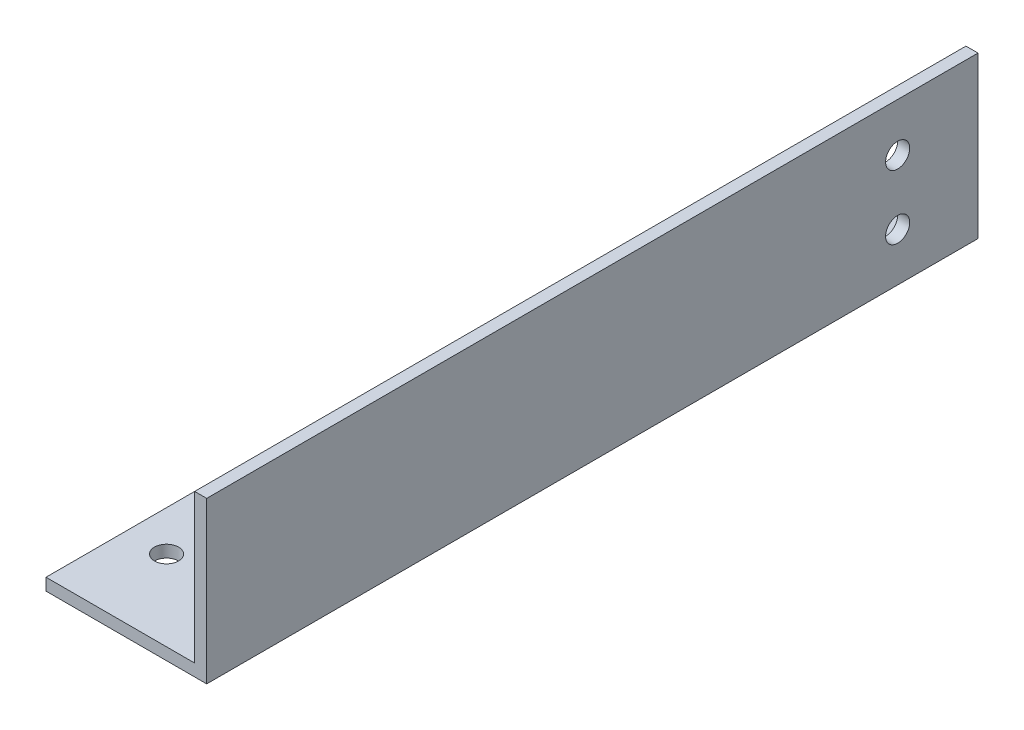
ISO-10303-21;
HEADER;
FILE_DESCRIPTION(('STEP AP214'),'2;1');
FILE_NAME('part.step','',(''),(''),'','','');
FILE_SCHEMA(('AUTOMOTIVE_DESIGN { 1 0 10303 214 1 1 1 1 }'));
ENDSEC;
DATA;
#1=APPLICATION_CONTEXT('core data for automotive mechanical design processes');
#2=APPLICATION_PROTOCOL_DEFINITION('international standard','automotive_design',2000,#1);
#3=PRODUCT_CONTEXT('',#1,'mechanical');
#4=PRODUCT('Part','Part','',(#3));
#5=PRODUCT_RELATED_PRODUCT_CATEGORY('part','',(#4));
#6=PRODUCT_DEFINITION_FORMATION('','',#4);
#7=PRODUCT_DEFINITION_CONTEXT('part definition',#1,'design');
#8=PRODUCT_DEFINITION('design','',#6,#7);
#9=PRODUCT_DEFINITION_SHAPE('','',#8);
#10=(LENGTH_UNIT() NAMED_UNIT(*) SI_UNIT(.MILLI.,.METRE.));
#11=(NAMED_UNIT(*) PLANE_ANGLE_UNIT() SI_UNIT($,.RADIAN.));
#12=(NAMED_UNIT(*) SI_UNIT($,.STERADIAN.) SOLID_ANGLE_UNIT());
#13=UNCERTAINTY_MEASURE_WITH_UNIT(LENGTH_MEASURE(1.E-05),#10,'distance_accuracy_value','');
#14=(GEOMETRIC_REPRESENTATION_CONTEXT(3) GLOBAL_UNCERTAINTY_ASSIGNED_CONTEXT((#13)) GLOBAL_UNIT_ASSIGNED_CONTEXT((#10,
#11,#12)) REPRESENTATION_CONTEXT('',''));
#15=CARTESIAN_POINT('',(0.,0.,0.));
#16=DIRECTION('',(0.,0.,1.));
#17=DIRECTION('',(1.,0.,0.));
#18=AXIS2_PLACEMENT_3D('',#15,#16,#17);
#19=CARTESIAN_POINT('',(-5.2189589692548,18.5,96.));
#20=DIRECTION('',(0.,-1.,0.));
#21=DIRECTION('',(0.,0.,-1.));
#22=AXIS2_PLACEMENT_3D('',#19,#20,#21);
#23=PLANE('',#22);
#24=DIRECTION('',(-1.,0.,0.));
#25=VECTOR('',#24,1.);
#26=CARTESIAN_POINT('',(-5.2189589692548,18.5,0.));
#27=LINE('',#26,#25);
#28=CARTESIAN_POINT('',(-3.7189589692548,18.5,0.));
#29=VERTEX_POINT('',#28);
#30=CARTESIAN_POINT('',(-5.2189589692548,18.5,0.));
#31=VERTEX_POINT('',#30);
#32=EDGE_CURVE('E115',#29,#31,#27,.T.);
#33=ORIENTED_EDGE('',*,*,#32,.T.);
#34=DIRECTION('',(0.,0.,-1.));
#35=VECTOR('',#34,1.);
#36=CARTESIAN_POINT('',(-5.2189589692548,18.5,96.));
#37=LINE('',#36,#35);
#38=CARTESIAN_POINT('',(-5.2189589692548,18.5,96.));
#39=VERTEX_POINT('',#38);
#40=EDGE_CURVE('E11',#39,#31,#37,.T.);
#41=ORIENTED_EDGE('',*,*,#40,.F.);
#42=DIRECTION('',(-1.,0.,0.));
#43=VECTOR('',#42,1.);
#44=CARTESIAN_POINT('',(-5.2189589692548,18.5,96.));
#45=LINE('',#44,#43);
#46=CARTESIAN_POINT('',(-3.7189589692548,18.5,96.));
#47=VERTEX_POINT('',#46);
#48=EDGE_CURVE('E126',#47,#39,#45,.T.);
#49=ORIENTED_EDGE('',*,*,#48,.F.);
#50=DIRECTION('',(0.,0.,-1.));
#51=VECTOR('',#50,1.);
#52=CARTESIAN_POINT('',(-3.7189589692548,18.5,96.));
#53=LINE('',#52,#51);
#54=EDGE_CURVE('E111',#47,#29,#53,.T.);
#55=ORIENTED_EDGE('',*,*,#54,.T.);
#56=EDGE_LOOP('',(#33,#41,#49,#55));
#57=FACE_BOUND('',#56,.T.);
#58=ADVANCED_FACE('F31',(#57),#23,.F.);
#59=CARTESIAN_POINT('',(-5.2189589692548,0.,96.));
#60=DIRECTION('',(1.,0.,0.));
#61=DIRECTION('',(0.,1.,0.));
#62=AXIS2_PLACEMENT_3D('',#59,#60,#61);
#63=PLANE('',#62);
#64=CARTESIAN_POINT('',(-5.2189589692548,4.5,10.));
#65=DIRECTION('',(1.,0.,0.));
#66=DIRECTION('',(0.,1.,0.));
#67=AXIS2_PLACEMENT_3D('',#64,#65,#66);
#68=CIRCLE('',#67,1.5);
#69=CARTESIAN_POINT('',(-5.2189589692548,6.,10.));
#70=VERTEX_POINT('',#69);
#71=EDGE_CURVE('E248',#70,#70,#68,.T.);
#72=ORIENTED_EDGE('',*,*,#71,.T.);
#73=EDGE_LOOP('',(#72));
#74=FACE_BOUND('',#73,.T.);
#75=CARTESIAN_POINT('',(-5.2189589692548,12.5,9.99999999999999));
#76=DIRECTION('',(1.,0.,0.));
#77=DIRECTION('',(0.,1.,0.));
#78=AXIS2_PLACEMENT_3D('',#75,#76,#77);
#79=CIRCLE('',#78,1.5);
#80=CARTESIAN_POINT('',(-5.2189589692548,14.,9.99999999999999));
#81=VERTEX_POINT('',#80);
#82=EDGE_CURVE('E252',#81,#81,#79,.T.);
#83=ORIENTED_EDGE('',*,*,#82,.T.);
#84=EDGE_LOOP('',(#83));
#85=FACE_BOUND('',#84,.T.);
#86=DIRECTION('',(0.,-1.,0.));
#87=VECTOR('',#86,1.);
#88=CARTESIAN_POINT('',(-5.2189589692548,0.,0.));
#89=LINE('',#88,#87);
#90=CARTESIAN_POINT('',(-5.2189589692548,0.,0.));
#91=VERTEX_POINT('',#90);
#92=EDGE_CURVE('E118',#31,#91,#89,.T.);
#93=ORIENTED_EDGE('',*,*,#92,.T.);
#94=DIRECTION('',(0.,0.,-1.));
#95=VECTOR('',#94,1.);
#96=CARTESIAN_POINT('',(-5.2189589692548,0.,96.));
#97=LINE('',#96,#95);
#98=CARTESIAN_POINT('',(-5.2189589692548,0.,96.));
#99=VERTEX_POINT('',#98);
#100=EDGE_CURVE('E39',#99,#91,#97,.T.);
#101=ORIENTED_EDGE('',*,*,#100,.F.);
#102=DIRECTION('',(0.,-1.,0.));
#103=VECTOR('',#102,1.);
#104=CARTESIAN_POINT('',(-5.2189589692548,0.,96.));
#105=LINE('',#104,#103);
#106=EDGE_CURVE('E84',#39,#99,#105,.T.);
#107=ORIENTED_EDGE('',*,*,#106,.F.);
#108=ORIENTED_EDGE('',*,*,#40,.T.);
#109=EDGE_LOOP('',(#93,#101,#107,#108));
#110=FACE_BOUND('',#109,.T.);
#111=ADVANCED_FACE('F154',(#74,#85,#110),#63,.F.);
#112=CARTESIAN_POINT('',(-23.7189589692548,0.,96.));
#113=DIRECTION('',(0.,-1.,0.));
#114=DIRECTION('',(0.,0.,-1.));
#115=AXIS2_PLACEMENT_3D('',#112,#113,#114);
#116=PLANE('',#115);
#117=CARTESIAN_POINT('',(-18.7189589692548,0.,86.));
#118=DIRECTION('',(0.,-1.,0.));
#119=DIRECTION('',(0.,0.,-1.));
#120=AXIS2_PLACEMENT_3D('',#117,#118,#119);
#121=CIRCLE('',#120,1.5);
#122=CARTESIAN_POINT('',(-18.7189589692548,0.,84.5));
#123=VERTEX_POINT('',#122);
#124=EDGE_CURVE('E261',#123,#123,#121,.T.);
#125=ORIENTED_EDGE('',*,*,#124,.T.);
#126=EDGE_LOOP('',(#125));
#127=FACE_BOUND('',#126,.T.);
#128=CARTESIAN_POINT('',(-8.7189589692548,0.,86.));
#129=DIRECTION('',(0.,-1.,0.));
#130=DIRECTION('',(0.,0.,-1.));
#131=AXIS2_PLACEMENT_3D('',#128,#129,#130);
#132=CIRCLE('',#131,1.5);
#133=CARTESIAN_POINT('',(-8.7189589692548,0.,84.5));
#134=VERTEX_POINT('',#133);
#135=EDGE_CURVE('E119',#134,#134,#132,.T.);
#136=ORIENTED_EDGE('',*,*,#135,.T.);
#137=EDGE_LOOP('',(#136));
#138=FACE_BOUND('',#137,.T.);
#139=DIRECTION('',(-1.,0.,0.));
#140=VECTOR('',#139,1.);
#141=CARTESIAN_POINT('',(-23.7189589692548,0.,0.));
#142=LINE('',#141,#140);
#143=CARTESIAN_POINT('',(-23.7189589692548,0.,0.));
#144=VERTEX_POINT('',#143);
#145=EDGE_CURVE('E121',#91,#144,#142,.T.);
#146=ORIENTED_EDGE('',*,*,#145,.T.);
#147=DIRECTION('',(0.,0.,-1.));
#148=VECTOR('',#147,1.);
#149=CARTESIAN_POINT('',(-23.7189589692548,0.,96.));
#150=LINE('',#149,#148);
#151=CARTESIAN_POINT('',(-23.7189589692548,0.,96.));
#152=VERTEX_POINT('',#151);
#153=EDGE_CURVE('E106',#152,#144,#150,.T.);
#154=ORIENTED_EDGE('',*,*,#153,.F.);
#155=DIRECTION('',(-1.,0.,0.));
#156=VECTOR('',#155,1.);
#157=CARTESIAN_POINT('',(-23.7189589692548,0.,96.));
#158=LINE('',#157,#156);
#159=EDGE_CURVE('E97',#99,#152,#158,.T.);
#160=ORIENTED_EDGE('',*,*,#159,.F.);
#161=ORIENTED_EDGE('',*,*,#100,.T.);
#162=EDGE_LOOP('',(#146,#154,#160,#161));
#163=FACE_BOUND('',#162,.T.);
#164=ADVANCED_FACE('F132',(#127,#138,#163),#116,.F.);
#165=CARTESIAN_POINT('',(-23.7189589692548,-1.5,96.));
#166=DIRECTION('',(1.,0.,0.));
#167=DIRECTION('',(0.,0.,-1.));
#168=AXIS2_PLACEMENT_3D('',#165,#166,#167);
#169=PLANE('',#168);
#170=DIRECTION('',(0.,-1.,0.));
#171=VECTOR('',#170,1.);
#172=CARTESIAN_POINT('',(-23.7189589692548,-1.5,0.));
#173=LINE('',#172,#171);
#174=CARTESIAN_POINT('',(-23.7189589692548,-1.5,0.));
#175=VERTEX_POINT('',#174);
#176=EDGE_CURVE('E105',#144,#175,#173,.T.);
#177=ORIENTED_EDGE('',*,*,#176,.T.);
#178=DIRECTION('',(0.,0.,-1.));
#179=VECTOR('',#178,1.);
#180=CARTESIAN_POINT('',(-23.7189589692548,-1.5,96.));
#181=LINE('',#180,#179);
#182=CARTESIAN_POINT('',(-23.7189589692548,-1.5,96.));
#183=VERTEX_POINT('',#182);
#184=EDGE_CURVE('E102',#183,#175,#181,.T.);
#185=ORIENTED_EDGE('',*,*,#184,.F.);
#186=DIRECTION('',(0.,-1.,0.));
#187=VECTOR('',#186,1.);
#188=CARTESIAN_POINT('',(-23.7189589692548,-1.5,96.));
#189=LINE('',#188,#187);
#190=EDGE_CURVE('E91',#152,#183,#189,.T.);
#191=ORIENTED_EDGE('',*,*,#190,.F.);
#192=ORIENTED_EDGE('',*,*,#153,.T.);
#193=EDGE_LOOP('',(#177,#185,#191,#192));
#194=FACE_BOUND('',#193,.T.);
#195=ADVANCED_FACE('F103',(#194),#169,.F.);
#196=CARTESIAN_POINT('',(-3.7189589692548,-1.5,96.));
#197=DIRECTION('',(0.,1.,0.));
#198=DIRECTION('',(-1.,0.,0.));
#199=AXIS2_PLACEMENT_3D('',#196,#197,#198);
#200=PLANE('',#199);
#201=CARTESIAN_POINT('',(-18.7189589692548,-1.5,86.));
#202=DIRECTION('',(0.,-1.,0.));
#203=DIRECTION('',(1.,0.,0.));
#204=AXIS2_PLACEMENT_3D('',#201,#202,#203);
#205=CIRCLE('',#204,1.5);
#206=CARTESIAN_POINT('',(-17.2189589692548,-1.5,86.));
#207=VERTEX_POINT('',#206);
#208=EDGE_CURVE('E258',#207,#207,#205,.T.);
#209=ORIENTED_EDGE('',*,*,#208,.F.);
#210=EDGE_LOOP('',(#209));
#211=FACE_BOUND('',#210,.T.);
#212=CARTESIAN_POINT('',(-8.7189589692548,-1.5,86.));
#213=DIRECTION('',(0.,-1.,0.));
#214=DIRECTION('',(1.,0.,0.));
#215=AXIS2_PLACEMENT_3D('',#212,#213,#214);
#216=CIRCLE('',#215,1.5);
#217=CARTESIAN_POINT('',(-7.2189589692548,-1.5,86.));
#218=VERTEX_POINT('',#217);
#219=EDGE_CURVE('E264',#218,#218,#216,.T.);
#220=ORIENTED_EDGE('',*,*,#219,.F.);
#221=EDGE_LOOP('',(#220));
#222=FACE_BOUND('',#221,.T.);
#223=DIRECTION('',(1.,0.,0.));
#224=VECTOR('',#223,1.);
#225=CARTESIAN_POINT('',(-3.7189589692548,-1.5,0.));
#226=LINE('',#225,#224);
#227=CARTESIAN_POINT('',(-3.7189589692548,-1.5,0.));
#228=VERTEX_POINT('',#227);
#229=EDGE_CURVE('E70',#175,#228,#226,.T.);
#230=ORIENTED_EDGE('',*,*,#229,.T.);
#231=DIRECTION('',(0.,0.,-1.));
#232=VECTOR('',#231,1.);
#233=CARTESIAN_POINT('',(-3.7189589692548,-1.5,96.));
#234=LINE('',#233,#232);
#235=CARTESIAN_POINT('',(-3.7189589692548,-1.5,96.));
#236=VERTEX_POINT('',#235);
#237=EDGE_CURVE('E107',#236,#228,#234,.T.);
#238=ORIENTED_EDGE('',*,*,#237,.F.);
#239=DIRECTION('',(1.,0.,0.));
#240=VECTOR('',#239,1.);
#241=CARTESIAN_POINT('',(-3.7189589692548,-1.5,96.));
#242=LINE('',#241,#240);
#243=EDGE_CURVE('E95',#183,#236,#242,.T.);
#244=ORIENTED_EDGE('',*,*,#243,.F.);
#245=ORIENTED_EDGE('',*,*,#184,.T.);
#246=EDGE_LOOP('',(#230,#238,#244,#245));
#247=FACE_BOUND('',#246,.T.);
#248=ADVANCED_FACE('F109',(#211,#222,#247),#200,.F.);
#249=CARTESIAN_POINT('',(-3.7189589692548,18.5,96.));
#250=DIRECTION('',(-1.,0.,0.));
#251=DIRECTION('',(0.,-1.,0.));
#252=AXIS2_PLACEMENT_3D('',#249,#250,#251);
#253=PLANE('',#252);
#254=CARTESIAN_POINT('',(-3.7189589692548,4.5,10.));
#255=DIRECTION('',(1.,0.,0.));
#256=DIRECTION('',(0.,1.,0.));
#257=AXIS2_PLACEMENT_3D('',#254,#255,#256);
#258=CIRCLE('',#257,1.5);
#259=CARTESIAN_POINT('',(-3.7189589692548,6.,10.));
#260=VERTEX_POINT('',#259);
#261=EDGE_CURVE('E246',#260,#260,#258,.T.);
#262=ORIENTED_EDGE('',*,*,#261,.F.);
#263=EDGE_LOOP('',(#262));
#264=FACE_BOUND('',#263,.T.);
#265=CARTESIAN_POINT('',(-3.7189589692548,12.5,9.99999999999999));
#266=DIRECTION('',(1.,0.,0.));
#267=DIRECTION('',(0.,1.,0.));
#268=AXIS2_PLACEMENT_3D('',#265,#266,#267);
#269=CIRCLE('',#268,1.5);
#270=CARTESIAN_POINT('',(-3.7189589692548,14.,9.99999999999999));
#271=VERTEX_POINT('',#270);
#272=EDGE_CURVE('E249',#271,#271,#269,.T.);
#273=ORIENTED_EDGE('',*,*,#272,.F.);
#274=EDGE_LOOP('',(#273));
#275=FACE_BOUND('',#274,.T.);
#276=DIRECTION('',(0.,1.,0.));
#277=VECTOR('',#276,1.);
#278=CARTESIAN_POINT('',(-3.7189589692548,18.5,0.));
#279=LINE('',#278,#277);
#280=EDGE_CURVE('E76',#228,#29,#279,.T.);
#281=ORIENTED_EDGE('',*,*,#280,.T.);
#282=ORIENTED_EDGE('',*,*,#54,.F.);
#283=DIRECTION('',(0.,1.,0.));
#284=VECTOR('',#283,1.);
#285=CARTESIAN_POINT('',(-3.7189589692548,18.5,96.));
#286=LINE('',#285,#284);
#287=EDGE_CURVE('E47',#236,#47,#286,.T.);
#288=ORIENTED_EDGE('',*,*,#287,.F.);
#289=ORIENTED_EDGE('',*,*,#237,.T.);
#290=EDGE_LOOP('',(#281,#282,#288,#289));
#291=FACE_BOUND('',#290,.T.);
#292=ADVANCED_FACE('F139',(#264,#275,#291),#253,.F.);
#293=CARTESIAN_POINT('',(-3.7189589692548,18.5,96.));
#294=DIRECTION('',(0.,0.,-1.));
#295=DIRECTION('',(-1.,0.,0.));
#296=AXIS2_PLACEMENT_3D('',#293,#294,#295);
#297=PLANE('',#296);
#298=ORIENTED_EDGE('',*,*,#48,.T.);
#299=ORIENTED_EDGE('',*,*,#106,.T.);
#300=ORIENTED_EDGE('',*,*,#159,.T.);
#301=ORIENTED_EDGE('',*,*,#190,.T.);
#302=ORIENTED_EDGE('',*,*,#243,.T.);
#303=ORIENTED_EDGE('',*,*,#287,.T.);
#304=EDGE_LOOP('',(#298,#299,#300,#301,#302,#303));
#305=FACE_BOUND('',#304,.T.);
#306=ADVANCED_FACE('F93',(#305),#297,.F.);
#307=CARTESIAN_POINT('',(-3.7189589692548,18.5,0.));
#308=DIRECTION('',(0.,0.,-1.));
#309=DIRECTION('',(-1.,0.,0.));
#310=AXIS2_PLACEMENT_3D('',#307,#308,#309);
#311=PLANE('',#310);
#312=ORIENTED_EDGE('',*,*,#32,.F.);
#313=ORIENTED_EDGE('',*,*,#280,.F.);
#314=ORIENTED_EDGE('',*,*,#229,.F.);
#315=ORIENTED_EDGE('',*,*,#176,.F.);
#316=ORIENTED_EDGE('',*,*,#145,.F.);
#317=ORIENTED_EDGE('',*,*,#92,.F.);
#318=EDGE_LOOP('',(#312,#313,#314,#315,#316,#317));
#319=FACE_BOUND('',#318,.T.);
#320=ADVANCED_FACE('F135',(#319),#311,.T.);
#321=CARTESIAN_POINT('',(-8.71895896925481,68.5,86.));
#322=DIRECTION('',(0.,-1.,0.));
#323=DIRECTION('',(1.,0.,0.));
#324=AXIS2_PLACEMENT_3D('',#321,#322,#323);
#325=CYLINDRICAL_SURFACE('',#324,1.5);
#326=ORIENTED_EDGE('',*,*,#219,.T.);
#327=EDGE_LOOP('',(#326));
#328=FACE_BOUND('',#327,.T.);
#329=ORIENTED_EDGE('',*,*,#135,.F.);
#330=EDGE_LOOP('',(#329));
#331=FACE_BOUND('',#330,.T.);
#332=ADVANCED_FACE('F186',(#328,#331),#325,.F.);
#333=CARTESIAN_POINT('',(-18.7189589692548,68.5,86.));
#334=DIRECTION('',(0.,-1.,0.));
#335=DIRECTION('',(1.,0.,0.));
#336=AXIS2_PLACEMENT_3D('',#333,#334,#335);
#337=CYLINDRICAL_SURFACE('',#336,1.5);
#338=ORIENTED_EDGE('',*,*,#208,.T.);
#339=EDGE_LOOP('',(#338));
#340=FACE_BOUND('',#339,.T.);
#341=ORIENTED_EDGE('',*,*,#124,.F.);
#342=EDGE_LOOP('',(#341));
#343=FACE_BOUND('',#342,.T.);
#344=ADVANCED_FACE('F191',(#340,#343),#337,.F.);
#345=CARTESIAN_POINT('',(-13.7189589692548,12.5,9.99999999999999));
#346=DIRECTION('',(1.,0.,0.));
#347=DIRECTION('',(0.,1.,0.));
#348=AXIS2_PLACEMENT_3D('',#345,#346,#347);
#349=CYLINDRICAL_SURFACE('',#348,1.5);
#350=ORIENTED_EDGE('',*,*,#272,.T.);
#351=EDGE_LOOP('',(#350));
#352=FACE_BOUND('',#351,.T.);
#353=ORIENTED_EDGE('',*,*,#82,.F.);
#354=EDGE_LOOP('',(#353));
#355=FACE_BOUND('',#354,.T.);
#356=ADVANCED_FACE('F202',(#352,#355),#349,.F.);
#357=CARTESIAN_POINT('',(-13.7189589692548,4.5,10.));
#358=DIRECTION('',(1.,0.,0.));
#359=DIRECTION('',(0.,1.,0.));
#360=AXIS2_PLACEMENT_3D('',#357,#358,#359);
#361=CYLINDRICAL_SURFACE('',#360,1.5);
#362=ORIENTED_EDGE('',*,*,#261,.T.);
#363=EDGE_LOOP('',(#362));
#364=FACE_BOUND('',#363,.T.);
#365=ORIENTED_EDGE('',*,*,#71,.F.);
#366=EDGE_LOOP('',(#365));
#367=FACE_BOUND('',#366,.T.);
#368=ADVANCED_FACE('F222',(#364,#367),#361,.F.);
#369=CLOSED_SHELL('',(#58,#111,#164,#195,#248,#292,#306,#320,#332,#344,#356,#368));
#370=MANIFOLD_SOLID_BREP('B2',#369);
#371=ADVANCED_BREP_SHAPE_REPRESENTATION('',(#18,#370),#14);
#372=SHAPE_DEFINITION_REPRESENTATION(#9,#371);
ENDSEC;
END-ISO-10303-21;
